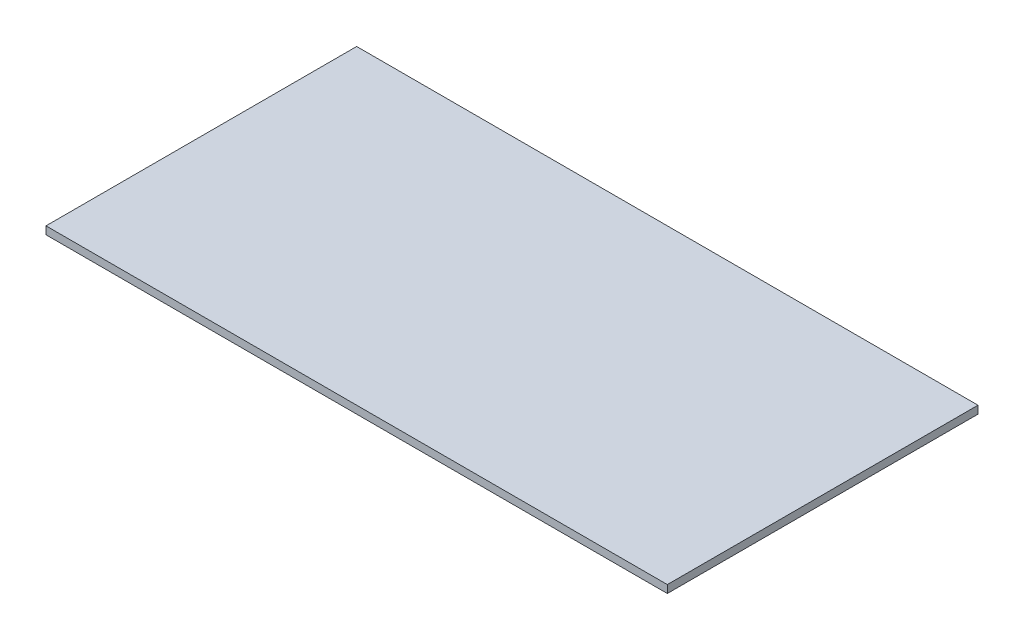
ISO-10303-21;
HEADER;
FILE_DESCRIPTION(('STEP AP214'),'2;1');
FILE_NAME('part.step','',(''),(''),'','','');
FILE_SCHEMA(('AUTOMOTIVE_DESIGN { 1 0 10303 214 1 1 1 1 }'));
ENDSEC;
DATA;
#1=APPLICATION_CONTEXT('core data for automotive mechanical design processes');
#2=APPLICATION_PROTOCOL_DEFINITION('international standard','automotive_design',2000,#1);
#3=PRODUCT_CONTEXT('',#1,'mechanical');
#4=PRODUCT('Part','Part','',(#3));
#5=PRODUCT_RELATED_PRODUCT_CATEGORY('part','',(#4));
#6=PRODUCT_DEFINITION_FORMATION('','',#4);
#7=PRODUCT_DEFINITION_CONTEXT('part definition',#1,'design');
#8=PRODUCT_DEFINITION('design','',#6,#7);
#9=PRODUCT_DEFINITION_SHAPE('','',#8);
#10=(LENGTH_UNIT() NAMED_UNIT(*) SI_UNIT(.MILLI.,.METRE.));
#11=(NAMED_UNIT(*) PLANE_ANGLE_UNIT() SI_UNIT($,.RADIAN.));
#12=(NAMED_UNIT(*) SI_UNIT($,.STERADIAN.) SOLID_ANGLE_UNIT());
#13=UNCERTAINTY_MEASURE_WITH_UNIT(LENGTH_MEASURE(1.E-05),#10,'distance_accuracy_value','');
#14=(GEOMETRIC_REPRESENTATION_CONTEXT(3) GLOBAL_UNCERTAINTY_ASSIGNED_CONTEXT((#13)) GLOBAL_UNIT_ASSIGNED_CONTEXT((#10,
#11,#12)) REPRESENTATION_CONTEXT('',''));
#15=CARTESIAN_POINT('',(0.,0.,0.));
#16=DIRECTION('',(0.,0.,1.));
#17=DIRECTION('',(1.,0.,0.));
#18=AXIS2_PLACEMENT_3D('',#15,#16,#17);
#19=CARTESIAN_POINT('',(200.,5.,100.));
#20=DIRECTION('',(-1.,0.,0.));
#21=DIRECTION('',(0.,0.,1.));
#22=AXIS2_PLACEMENT_3D('',#19,#20,#21);
#23=PLANE('',#22);
#24=DIRECTION('',(0.,0.,-1.));
#25=VECTOR('',#24,1.);
#26=CARTESIAN_POINT('',(200.,0.,100.));
#27=LINE('',#26,#25);
#28=CARTESIAN_POINT('',(200.,0.,100.));
#29=VERTEX_POINT('',#28);
#30=CARTESIAN_POINT('',(200.,0.,-100.));
#31=VERTEX_POINT('',#30);
#32=EDGE_CURVE('E107',#29,#31,#27,.T.);
#33=ORIENTED_EDGE('',*,*,#32,.T.);
#34=DIRECTION('',(0.,-1.,0.));
#35=VECTOR('',#34,1.);
#36=CARTESIAN_POINT('',(200.,5.,-100.));
#37=LINE('',#36,#35);
#38=CARTESIAN_POINT('',(200.,5.,-100.));
#39=VERTEX_POINT('',#38);
#40=EDGE_CURVE('E11',#39,#31,#37,.T.);
#41=ORIENTED_EDGE('',*,*,#40,.F.);
#42=DIRECTION('',(0.,0.,-1.));
#43=VECTOR('',#42,1.);
#44=CARTESIAN_POINT('',(200.,5.,100.));
#45=LINE('',#44,#43);
#46=CARTESIAN_POINT('',(200.,5.,100.));
#47=VERTEX_POINT('',#46);
#48=EDGE_CURVE('E91',#47,#39,#45,.T.);
#49=ORIENTED_EDGE('',*,*,#48,.F.);
#50=DIRECTION('',(0.,-1.,0.));
#51=VECTOR('',#50,1.);
#52=CARTESIAN_POINT('',(200.,5.,100.));
#53=LINE('',#52,#51);
#54=EDGE_CURVE('E103',#47,#29,#53,.T.);
#55=ORIENTED_EDGE('',*,*,#54,.T.);
#56=EDGE_LOOP('',(#33,#41,#49,#55));
#57=FACE_BOUND('',#56,.T.);
#58=ADVANCED_FACE('F39',(#57),#23,.F.);
#59=CARTESIAN_POINT('',(-200.,5.,-100.));
#60=DIRECTION('',(0.,0.,1.));
#61=DIRECTION('',(1.,0.,0.));
#62=AXIS2_PLACEMENT_3D('',#59,#60,#61);
#63=PLANE('',#62);
#64=DIRECTION('',(-1.,0.,0.));
#65=VECTOR('',#64,1.);
#66=CARTESIAN_POINT('',(-200.,0.,-100.));
#67=LINE('',#66,#65);
#68=CARTESIAN_POINT('',(-200.,0.,-100.));
#69=VERTEX_POINT('',#68);
#70=EDGE_CURVE('E96',#31,#69,#67,.T.);
#71=ORIENTED_EDGE('',*,*,#70,.T.);
#72=DIRECTION('',(0.,-1.,0.));
#73=VECTOR('',#72,1.);
#74=CARTESIAN_POINT('',(-200.,5.,-100.));
#75=LINE('',#74,#73);
#76=CARTESIAN_POINT('',(-200.,5.,-100.));
#77=VERTEX_POINT('',#76);
#78=EDGE_CURVE('E48',#77,#69,#75,.T.);
#79=ORIENTED_EDGE('',*,*,#78,.F.);
#80=DIRECTION('',(-1.,0.,0.));
#81=VECTOR('',#80,1.);
#82=CARTESIAN_POINT('',(-200.,5.,-100.));
#83=LINE('',#82,#81);
#84=EDGE_CURVE('E86',#39,#77,#83,.T.);
#85=ORIENTED_EDGE('',*,*,#84,.F.);
#86=ORIENTED_EDGE('',*,*,#40,.T.);
#87=EDGE_LOOP('',(#71,#79,#85,#86));
#88=FACE_BOUND('',#87,.T.);
#89=ADVANCED_FACE('F95',(#88),#63,.F.);
#90=CARTESIAN_POINT('',(-200.,5.,100.));
#91=DIRECTION('',(1.,0.,0.));
#92=DIRECTION('',(0.,0.,-1.));
#93=AXIS2_PLACEMENT_3D('',#90,#91,#92);
#94=PLANE('',#93);
#95=DIRECTION('',(0.,0.,1.));
#96=VECTOR('',#95,1.);
#97=CARTESIAN_POINT('',(-200.,0.,100.));
#98=LINE('',#97,#96);
#99=CARTESIAN_POINT('',(-200.,0.,100.));
#100=VERTEX_POINT('',#99);
#101=EDGE_CURVE('E73',#69,#100,#98,.T.);
#102=ORIENTED_EDGE('',*,*,#101,.T.);
#103=DIRECTION('',(0.,-1.,0.));
#104=VECTOR('',#103,1.);
#105=CARTESIAN_POINT('',(-200.,5.,100.));
#106=LINE('',#105,#104);
#107=CARTESIAN_POINT('',(-200.,5.,100.));
#108=VERTEX_POINT('',#107);
#109=EDGE_CURVE('E98',#108,#100,#106,.T.);
#110=ORIENTED_EDGE('',*,*,#109,.F.);
#111=DIRECTION('',(0.,0.,1.));
#112=VECTOR('',#111,1.);
#113=CARTESIAN_POINT('',(-200.,5.,100.));
#114=LINE('',#113,#112);
#115=EDGE_CURVE('E89',#77,#108,#114,.T.);
#116=ORIENTED_EDGE('',*,*,#115,.F.);
#117=ORIENTED_EDGE('',*,*,#78,.T.);
#118=EDGE_LOOP('',(#102,#110,#116,#117));
#119=FACE_BOUND('',#118,.T.);
#120=ADVANCED_FACE('F99',(#119),#94,.F.);
#121=CARTESIAN_POINT('',(-200.,5.,100.));
#122=DIRECTION('',(0.,0.,-1.));
#123=DIRECTION('',(-1.,0.,0.));
#124=AXIS2_PLACEMENT_3D('',#121,#122,#123);
#125=PLANE('',#124);
#126=DIRECTION('',(1.,0.,0.));
#127=VECTOR('',#126,1.);
#128=CARTESIAN_POINT('',(-200.,0.,100.));
#129=LINE('',#128,#127);
#130=EDGE_CURVE('E79',#100,#29,#129,.T.);
#131=ORIENTED_EDGE('',*,*,#130,.T.);
#132=ORIENTED_EDGE('',*,*,#54,.F.);
#133=DIRECTION('',(1.,0.,0.));
#134=VECTOR('',#133,1.);
#135=CARTESIAN_POINT('',(-200.,5.,100.));
#136=LINE('',#135,#134);
#137=EDGE_CURVE('E56',#108,#47,#136,.T.);
#138=ORIENTED_EDGE('',*,*,#137,.F.);
#139=ORIENTED_EDGE('',*,*,#109,.T.);
#140=EDGE_LOOP('',(#131,#132,#138,#139));
#141=FACE_BOUND('',#140,.T.);
#142=ADVANCED_FACE('F120',(#141),#125,.F.);
#143=CARTESIAN_POINT('',(0.,5.,0.));
#144=DIRECTION('',(0.,-1.,0.));
#145=DIRECTION('',(0.,0.,-1.));
#146=AXIS2_PLACEMENT_3D('',#143,#144,#145);
#147=PLANE('',#146);
#148=ORIENTED_EDGE('',*,*,#48,.T.);
#149=ORIENTED_EDGE('',*,*,#84,.T.);
#150=ORIENTED_EDGE('',*,*,#115,.T.);
#151=ORIENTED_EDGE('',*,*,#137,.T.);
#152=EDGE_LOOP('',(#148,#149,#150,#151));
#153=FACE_BOUND('',#152,.T.);
#154=ADVANCED_FACE('F87',(#153),#147,.F.);
#155=CARTESIAN_POINT('',(0.,0.,0.));
#156=DIRECTION('',(0.,-1.,0.));
#157=DIRECTION('',(0.,0.,-1.));
#158=AXIS2_PLACEMENT_3D('',#155,#156,#157);
#159=PLANE('',#158);
#160=ORIENTED_EDGE('',*,*,#32,.F.);
#161=ORIENTED_EDGE('',*,*,#130,.F.);
#162=ORIENTED_EDGE('',*,*,#101,.F.);
#163=ORIENTED_EDGE('',*,*,#70,.F.);
#164=EDGE_LOOP('',(#160,#161,#162,#163));
#165=FACE_BOUND('',#164,.T.);
#166=ADVANCED_FACE('F123',(#165),#159,.T.);
#167=CLOSED_SHELL('',(#58,#89,#120,#142,#154,#166));
#168=MANIFOLD_SOLID_BREP('B2',#167);
#169=ADVANCED_BREP_SHAPE_REPRESENTATION('',(#18,#168),#14);
#170=SHAPE_DEFINITION_REPRESENTATION(#9,#169);
ENDSEC;
END-ISO-10303-21;
